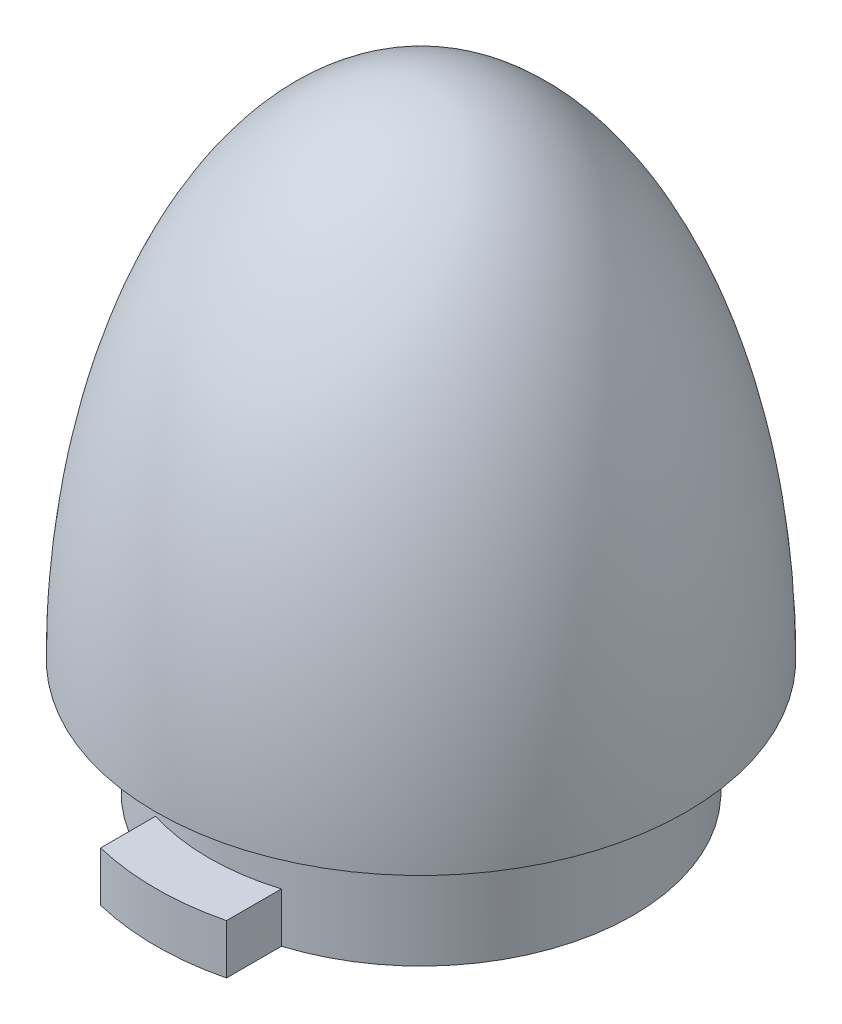
ISO-10303-21;
HEADER;
FILE_DESCRIPTION(('STEP AP214'),'2;1');
FILE_NAME('part.step','',(''),(''),'','','');
FILE_SCHEMA(('AUTOMOTIVE_DESIGN { 1 0 10303 214 1 1 1 1 }'));
ENDSEC;
DATA;
#1=APPLICATION_CONTEXT('core data for automotive mechanical design processes');
#2=APPLICATION_PROTOCOL_DEFINITION('international standard','automotive_design',2000,#1);
#3=PRODUCT_CONTEXT('',#1,'mechanical');
#4=PRODUCT('Part','Part','',(#3));
#5=PRODUCT_RELATED_PRODUCT_CATEGORY('part','',(#4));
#6=PRODUCT_DEFINITION_FORMATION('','',#4);
#7=PRODUCT_DEFINITION_CONTEXT('part definition',#1,'design');
#8=PRODUCT_DEFINITION('design','',#6,#7);
#9=PRODUCT_DEFINITION_SHAPE('','',#8);
#10=(LENGTH_UNIT() NAMED_UNIT(*) SI_UNIT(.MILLI.,.METRE.));
#11=(NAMED_UNIT(*) PLANE_ANGLE_UNIT() SI_UNIT($,.RADIAN.));
#12=(NAMED_UNIT(*) SI_UNIT($,.STERADIAN.) SOLID_ANGLE_UNIT());
#13=UNCERTAINTY_MEASURE_WITH_UNIT(LENGTH_MEASURE(1.E-05),#10,'distance_accuracy_value','');
#14=(GEOMETRIC_REPRESENTATION_CONTEXT(3) GLOBAL_UNCERTAINTY_ASSIGNED_CONTEXT((#13)) GLOBAL_UNIT_ASSIGNED_CONTEXT((#10,
#11,#12)) REPRESENTATION_CONTEXT('',''));
#15=CARTESIAN_POINT('',(0.,0.,0.));
#16=DIRECTION('',(0.,0.,1.));
#17=DIRECTION('',(1.,0.,0.));
#18=AXIS2_PLACEMENT_3D('',#15,#16,#17);
#19=CARTESIAN_POINT('',(0.,0.,8.128));
#20=DIRECTION('',(0.,1.,0.));
#21=DIRECTION('',(0.,0.,1.));
#22=AXIS2_PLACEMENT_3D('',#19,#20,#21);
#23=PLANE('',#22);
#24=CARTESIAN_POINT('',(0.,0.,0.));
#25=DIRECTION('',(0.,-1.,0.));
#26=DIRECTION('',(0.,0.,-1.));
#27=AXIS2_PLACEMENT_3D('',#24,#25,#26);
#28=CIRCLE('',#27,6.096);
#29=CARTESIAN_POINT('',(0.,0.,-6.096));
#30=VERTEX_POINT('',#29);
#31=EDGE_CURVE('E166',#30,#30,#28,.T.);
#32=ORIENTED_EDGE('',*,*,#31,.F.);
#33=EDGE_LOOP('',(#32));
#34=FACE_BOUND('',#33,.T.);
#35=CARTESIAN_POINT('',(0.,0.,0.));
#36=DIRECTION('',(0.,-1.,0.));
#37=DIRECTION('',(0.,0.,-1.));
#38=AXIS2_PLACEMENT_3D('',#35,#36,#37);
#39=CIRCLE('',#38,8.128);
#40=CARTESIAN_POINT('',(-2.413,0.,7.76156008802354));
#41=VERTEX_POINT('',#40);
#42=CARTESIAN_POINT('',(-2.413,0.,-7.76156008802354));
#43=VERTEX_POINT('',#42);
#44=EDGE_CURVE('E11',#41,#43,#39,.T.);
#45=ORIENTED_EDGE('',*,*,#44,.T.);
#46=DIRECTION('',(0.,0.,-1.));
#47=VECTOR('',#46,1.);
#48=CARTESIAN_POINT('',(-2.41299999999999,0.,8.128));
#49=LINE('',#48,#47);
#50=CARTESIAN_POINT('',(-2.413,0.,-9.86929739140533));
#51=VERTEX_POINT('',#50);
#52=EDGE_CURVE('E122',#43,#51,#49,.T.);
#53=ORIENTED_EDGE('',*,*,#52,.T.);
#54=CARTESIAN_POINT('',(0.,0.,0.));
#55=DIRECTION('',(0.,1.,0.));
#56=DIRECTION('',(0.,0.,1.));
#57=AXIS2_PLACEMENT_3D('',#54,#55,#56);
#58=CIRCLE('',#57,10.16);
#59=CARTESIAN_POINT('',(2.413,0.,-9.86929739140533));
#60=VERTEX_POINT('',#59);
#61=EDGE_CURVE('E113',#60,#51,#58,.T.);
#62=ORIENTED_EDGE('',*,*,#61,.F.);
#63=DIRECTION('',(0.,0.,1.));
#64=VECTOR('',#63,1.);
#65=CARTESIAN_POINT('',(2.41299999999999,0.,8.128));
#66=LINE('',#65,#64);
#67=CARTESIAN_POINT('',(2.413,0.,-7.76156008802354));
#68=VERTEX_POINT('',#67);
#69=EDGE_CURVE('E53',#60,#68,#66,.T.);
#70=ORIENTED_EDGE('',*,*,#69,.T.);
#71=CARTESIAN_POINT('',(2.413,0.,7.76156008802354));
#72=VERTEX_POINT('',#71);
#73=EDGE_CURVE('E46',#68,#72,#39,.T.);
#74=ORIENTED_EDGE('',*,*,#73,.T.);
#75=DIRECTION('',(0.,0.,1.));
#76=VECTOR('',#75,1.);
#77=CARTESIAN_POINT('',(2.413,0.,8.128));
#78=LINE('',#77,#76);
#79=CARTESIAN_POINT('',(2.413,0.,9.86929739140533));
#80=VERTEX_POINT('',#79);
#81=EDGE_CURVE('E154',#72,#80,#78,.T.);
#82=ORIENTED_EDGE('',*,*,#81,.T.);
#83=CARTESIAN_POINT('',(0.,0.,0.));
#84=DIRECTION('',(0.,1.,0.));
#85=DIRECTION('',(0.,0.,1.));
#86=AXIS2_PLACEMENT_3D('',#83,#84,#85);
#87=CIRCLE('',#86,10.16);
#88=CARTESIAN_POINT('',(-2.413,0.,9.86929739140533));
#89=VERTEX_POINT('',#88);
#90=EDGE_CURVE('E123',#89,#80,#87,.T.);
#91=ORIENTED_EDGE('',*,*,#90,.F.);
#92=DIRECTION('',(0.,0.,-1.));
#93=VECTOR('',#92,1.);
#94=CARTESIAN_POINT('',(-2.413,0.,8.128));
#95=LINE('',#94,#93);
#96=EDGE_CURVE('E59',#89,#41,#95,.T.);
#97=ORIENTED_EDGE('',*,*,#96,.T.);
#98=EDGE_LOOP('',(#45,#53,#62,#70,#74,#82,#91,#97));
#99=FACE_BOUND('',#98,.T.);
#100=ADVANCED_FACE('F39',(#34,#99),#23,.F.);
#101=CARTESIAN_POINT('',(0.,0.,0.));
#102=DIRECTION('',(0.,-1.,0.));
#103=DIRECTION('',(0.,0.,-1.));
#104=AXIS2_PLACEMENT_3D('',#101,#102,#103);
#105=CYLINDRICAL_SURFACE('',#104,8.128);
#106=CARTESIAN_POINT('',(0.,1.905,0.));
#107=DIRECTION('',(0.,1.,0.));
#108=DIRECTION('',(0.,0.,1.));
#109=AXIS2_PLACEMENT_3D('',#106,#107,#108);
#110=CIRCLE('',#109,8.128);
#111=CARTESIAN_POINT('',(2.413,1.905,-7.76156008802354));
#112=VERTEX_POINT('',#111);
#113=CARTESIAN_POINT('',(-2.413,1.905,-7.76156008802354));
#114=VERTEX_POINT('',#113);
#115=EDGE_CURVE('E135',#112,#114,#110,.T.);
#116=ORIENTED_EDGE('',*,*,#115,.T.);
#117=DIRECTION('',(0.,-1.,0.));
#118=VECTOR('',#117,1.);
#119=CARTESIAN_POINT('',(-2.413,1.905,-7.76156008802354));
#120=LINE('',#119,#118);
#121=EDGE_CURVE('E373',#114,#43,#120,.T.);
#122=ORIENTED_EDGE('',*,*,#121,.T.);
#123=ORIENTED_EDGE('',*,*,#44,.F.);
#124=DIRECTION('',(0.,-1.,0.));
#125=VECTOR('',#124,1.);
#126=CARTESIAN_POINT('',(-2.413,1.905,7.76156008802354));
#127=LINE('',#126,#125);
#128=CARTESIAN_POINT('',(-2.413,1.905,7.76156008802354));
#129=VERTEX_POINT('',#128);
#130=EDGE_CURVE('E159',#129,#41,#127,.T.);
#131=ORIENTED_EDGE('',*,*,#130,.F.);
#132=CARTESIAN_POINT('',(0.,1.905,0.));
#133=DIRECTION('',(0.,1.,0.));
#134=DIRECTION('',(0.,0.,1.));
#135=AXIS2_PLACEMENT_3D('',#132,#133,#134);
#136=CIRCLE('',#135,8.128);
#137=CARTESIAN_POINT('',(2.413,1.905,7.76156008802354));
#138=VERTEX_POINT('',#137);
#139=EDGE_CURVE('E145',#129,#138,#136,.T.);
#140=ORIENTED_EDGE('',*,*,#139,.T.);
#141=DIRECTION('',(0.,-1.,0.));
#142=VECTOR('',#141,1.);
#143=CARTESIAN_POINT('',(2.413,1.905,7.76156008802354));
#144=LINE('',#143,#142);
#145=EDGE_CURVE('E161',#138,#72,#144,.T.);
#146=ORIENTED_EDGE('',*,*,#145,.T.);
#147=ORIENTED_EDGE('',*,*,#73,.F.);
#148=DIRECTION('',(0.,-1.,0.));
#149=VECTOR('',#148,1.);
#150=CARTESIAN_POINT('',(2.413,1.905,-7.76156008802354));
#151=LINE('',#150,#149);
#152=EDGE_CURVE('E120',#112,#68,#151,.T.);
#153=ORIENTED_EDGE('',*,*,#152,.F.);
#154=EDGE_LOOP('',(#116,#122,#123,#131,#140,#146,#147,#153));
#155=FACE_BOUND('',#154,.T.);
#156=CARTESIAN_POINT('',(0.,4.445,0.));
#157=DIRECTION('',(0.,-1.,0.));
#158=DIRECTION('',(0.,0.,-1.));
#159=AXIS2_PLACEMENT_3D('',#156,#157,#158);
#160=CIRCLE('',#159,8.128);
#161=CARTESIAN_POINT('',(0.,4.445,-8.128));
#162=VERTEX_POINT('',#161);
#163=EDGE_CURVE('E202',#162,#162,#160,.T.);
#164=ORIENTED_EDGE('',*,*,#163,.T.);
#165=EDGE_LOOP('',(#164));
#166=FACE_BOUND('',#165,.T.);
#167=ADVANCED_FACE('F190',(#155,#166),#105,.T.);
#168=CARTESIAN_POINT('',(0.,4.445,8.128));
#169=DIRECTION('',(0.,1.,0.));
#170=DIRECTION('',(0.,0.,1.));
#171=AXIS2_PLACEMENT_3D('',#168,#169,#170);
#172=PLANE('',#171);
#173=ORIENTED_EDGE('',*,*,#163,.F.);
#174=EDGE_LOOP('',(#173));
#175=FACE_BOUND('',#174,.T.);
#176=CARTESIAN_POINT('',(0.,4.445,0.));
#177=DIRECTION('',(0.,-1.,0.));
#178=DIRECTION('',(0.,0.,-1.));
#179=AXIS2_PLACEMENT_3D('',#176,#177,#178);
#180=CIRCLE('',#179,10.16);
#181=CARTESIAN_POINT('',(0.,4.445,-10.16));
#182=VERTEX_POINT('',#181);
#183=EDGE_CURVE('E203',#182,#182,#180,.T.);
#184=ORIENTED_EDGE('',*,*,#183,.T.);
#185=EDGE_LOOP('',(#184));
#186=FACE_BOUND('',#185,.T.);
#187=ADVANCED_FACE('F187',(#175,#186),#172,.F.);
#188=CARTESIAN_POINT('',(0.,4.445,1.31385821547456E-13));
#189=DIRECTION('',(1.,0.,0.));
#190=DIRECTION('',(0.,-1.,0.));
#191=AXIS2_PLACEMENT_3D('',#188,#189,#190);
#192=ELLIPSE('',#191,19.05,10.1599999999999);
#193=TRIMMED_CURVE('',#192,(PARAMETER_VALUE(3.14159265358978)),
(PARAMETER_VALUE(6.2831853071796)),.T.,.PARAMETER.);
#194=CARTESIAN_POINT('',(0.,0.,0.));
#195=DIRECTION('',(0.,-1.,0.));
#196=AXIS1_PLACEMENT('',#194,#195);
#197=SURFACE_OF_REVOLUTION('',#193,#196);
#198=ORIENTED_EDGE('',*,*,#183,.F.);
#199=EDGE_LOOP('',(#198));
#200=FACE_BOUND('',#199,.T.);
#201=CARTESIAN_POINT('',(0.,23.495,0.));
#202=VERTEX_POINT('',#201);
#203=VERTEX_LOOP('',#202);
#204=FACE_BOUND('',#203,.T.);
#205=ADVANCED_FACE('F182',(#200,#204),#197,.T.);
#206=CARTESIAN_POINT('',(0.,6.47700000000001,8.06650855524508));
#207=CARTESIAN_POINT('',(0.,7.54516851846274,8.00164177222113));
#208=CARTESIAN_POINT('',(0.,9.70775905244594,7.76329370612508));
#209=CARTESIAN_POINT('',(0.,12.7129061846973,7.10849540277122));
#210=CARTESIAN_POINT('',(0.,15.4166874288281,6.18547281986769));
#211=CARTESIAN_POINT('',(0.,17.6991720978405,5.04556665310744));
#212=CARTESIAN_POINT('',(0.,19.4747331163462,3.75998048202053));
#213=CARTESIAN_POINT('',(0.,20.6847050617529,2.42944522517798));
#214=CARTESIAN_POINT('',(0.,21.335826730527,1.1533899415434));
#215=CARTESIAN_POINT('',(0.,21.463,0.398270958817136));
#216=CARTESIAN_POINT('',(0.,21.463,0.));
#217=B_SPLINE_CURVE_WITH_KNOTS('',3,(#206,#207,#208,#209,#210,#211,#212,#213,#214,#215,#216),
.UNSPECIFIED.,.F.,.F.,(4,1,1,1,1,1,1,1,4),(3.14159265358978,3.3237703140792,3.50594797456862,
3.68812563505804,3.87030329554746,4.05248095603688,4.2346586165263,4.41683627701572,
4.59901393750514),.UNSPECIFIED.);
#218=CARTESIAN_POINT('',(0.,0.,0.));
#219=DIRECTION('',(0.,-1.,0.));
#220=AXIS1_PLACEMENT('',#218,#219);
#221=SURFACE_OF_REVOLUTION('',#217,#220);
#222=CARTESIAN_POINT('',(0.,21.463,0.));
#223=VERTEX_POINT('',#222);
#224=VERTEX_LOOP('',#223);
#225=FACE_BOUND('',#224,.T.);
#226=CARTESIAN_POINT('',(0.,6.47700000000001,0.));
#227=DIRECTION('',(0.,-1.,0.));
#228=DIRECTION('',(0.,0.,-1.));
#229=AXIS2_PLACEMENT_3D('',#226,#227,#228);
#230=CIRCLE('',#229,8.06650855524508);
#231=CARTESIAN_POINT('',(0.,6.47700000000001,-8.06650855524508));
#232=VERTEX_POINT('',#231);
#233=EDGE_CURVE('E205',#232,#232,#230,.T.);
#234=ORIENTED_EDGE('',*,*,#233,.T.);
#235=EDGE_LOOP('',(#234));
#236=FACE_BOUND('',#235,.T.);
#237=ADVANCED_FACE('F177',(#225,#236),#221,.T.);
#238=CARTESIAN_POINT('',(0.,6.47700000000001,6.096));
#239=DIRECTION('',(0.,-1.,0.));
#240=DIRECTION('',(0.,0.,-1.));
#241=AXIS2_PLACEMENT_3D('',#238,#239,#240);
#242=PLANE('',#241);
#243=ORIENTED_EDGE('',*,*,#233,.F.);
#244=EDGE_LOOP('',(#243));
#245=FACE_BOUND('',#244,.T.);
#246=CARTESIAN_POINT('',(0.,6.477,0.));
#247=DIRECTION('',(0.,-1.,0.));
#248=DIRECTION('',(0.,0.,-1.));
#249=AXIS2_PLACEMENT_3D('',#246,#247,#248);
#250=CIRCLE('',#249,6.096);
#251=CARTESIAN_POINT('',(0.,6.477,-6.096));
#252=VERTEX_POINT('',#251);
#253=EDGE_CURVE('E210',#252,#252,#250,.T.);
#254=ORIENTED_EDGE('',*,*,#253,.T.);
#255=EDGE_LOOP('',(#254));
#256=FACE_BOUND('',#255,.T.);
#257=ADVANCED_FACE('F181',(#245,#256),#242,.F.);
#258=CARTESIAN_POINT('',(0.,0.,0.));
#259=DIRECTION('',(0.,-1.,0.));
#260=DIRECTION('',(0.,0.,-1.));
#261=AXIS2_PLACEMENT_3D('',#258,#259,#260);
#262=CYLINDRICAL_SURFACE('',#261,6.096);
#263=ORIENTED_EDGE('',*,*,#253,.F.);
#264=EDGE_LOOP('',(#263));
#265=FACE_BOUND('',#264,.T.);
#266=ORIENTED_EDGE('',*,*,#31,.T.);
#267=EDGE_LOOP('',(#266));
#268=FACE_BOUND('',#267,.T.);
#269=ADVANCED_FACE('F215',(#265,#268),#262,.F.);
#270=CARTESIAN_POINT('',(0.,1.905,0.));
#271=DIRECTION('',(0.,-1.,0.));
#272=DIRECTION('',(0.,0.,-1.));
#273=AXIS2_PLACEMENT_3D('',#270,#271,#272);
#274=CYLINDRICAL_SURFACE('',#273,10.16);
#275=ORIENTED_EDGE('',*,*,#90,.T.);
#276=DIRECTION('',(0.,-1.,0.));
#277=VECTOR('',#276,1.);
#278=CARTESIAN_POINT('',(2.413,1.905,9.86929739140533));
#279=LINE('',#278,#277);
#280=CARTESIAN_POINT('',(2.413,1.905,9.86929739140533));
#281=VERTEX_POINT('',#280);
#282=EDGE_CURVE('E164',#281,#80,#279,.T.);
#283=ORIENTED_EDGE('',*,*,#282,.F.);
#284=CARTESIAN_POINT('',(0.,1.905,0.));
#285=DIRECTION('',(0.,1.,0.));
#286=DIRECTION('',(0.,0.,1.));
#287=AXIS2_PLACEMENT_3D('',#284,#285,#286);
#288=CIRCLE('',#287,10.16);
#289=CARTESIAN_POINT('',(-2.413,1.905,9.86929739140533));
#290=VERTEX_POINT('',#289);
#291=EDGE_CURVE('E140',#290,#281,#288,.T.);
#292=ORIENTED_EDGE('',*,*,#291,.F.);
#293=DIRECTION('',(0.,-1.,0.));
#294=VECTOR('',#293,1.);
#295=CARTESIAN_POINT('',(-2.413,1.905,9.86929739140533));
#296=LINE('',#295,#294);
#297=EDGE_CURVE('E151',#290,#89,#296,.T.);
#298=ORIENTED_EDGE('',*,*,#297,.T.);
#299=EDGE_LOOP('',(#275,#283,#292,#298));
#300=FACE_BOUND('',#299,.T.);
#301=ADVANCED_FACE('F217',(#300),#274,.T.);
#302=CARTESIAN_POINT('',(2.413,1.905,8.128));
#303=DIRECTION('',(1.,0.,0.));
#304=DIRECTION('',(0.,0.,-1.));
#305=AXIS2_PLACEMENT_3D('',#302,#303,#304);
#306=PLANE('',#305);
#307=ORIENTED_EDGE('',*,*,#81,.F.);
#308=ORIENTED_EDGE('',*,*,#145,.F.);
#309=DIRECTION('',(0.,0.,1.));
#310=VECTOR('',#309,1.);
#311=CARTESIAN_POINT('',(2.413,1.905,8.128));
#312=LINE('',#311,#310);
#313=EDGE_CURVE('E142',#138,#281,#312,.T.);
#314=ORIENTED_EDGE('',*,*,#313,.T.);
#315=ORIENTED_EDGE('',*,*,#282,.T.);
#316=EDGE_LOOP('',(#307,#308,#314,#315));
#317=FACE_BOUND('',#316,.T.);
#318=ADVANCED_FACE('F223',(#317),#306,.T.);
#319=CARTESIAN_POINT('',(-2.413,1.905,8.128));
#320=DIRECTION('',(-1.,0.,0.));
#321=DIRECTION('',(0.,0.,1.));
#322=AXIS2_PLACEMENT_3D('',#319,#320,#321);
#323=PLANE('',#322);
#324=ORIENTED_EDGE('',*,*,#96,.F.);
#325=ORIENTED_EDGE('',*,*,#297,.F.);
#326=DIRECTION('',(0.,0.,-1.));
#327=VECTOR('',#326,1.);
#328=CARTESIAN_POINT('',(-2.413,1.905,8.128));
#329=LINE('',#328,#327);
#330=EDGE_CURVE('E148',#290,#129,#329,.T.);
#331=ORIENTED_EDGE('',*,*,#330,.T.);
#332=ORIENTED_EDGE('',*,*,#130,.T.);
#333=EDGE_LOOP('',(#324,#325,#331,#332));
#334=FACE_BOUND('',#333,.T.);
#335=ADVANCED_FACE('F231',(#334),#323,.T.);
#336=CARTESIAN_POINT('',(0.,1.905,0.));
#337=DIRECTION('',(0.,1.,0.));
#338=DIRECTION('',(0.,0.,1.));
#339=AXIS2_PLACEMENT_3D('',#336,#337,#338);
#340=PLANE('',#339);
#341=ORIENTED_EDGE('',*,*,#291,.T.);
#342=ORIENTED_EDGE('',*,*,#313,.F.);
#343=ORIENTED_EDGE('',*,*,#139,.F.);
#344=ORIENTED_EDGE('',*,*,#330,.F.);
#345=EDGE_LOOP('',(#341,#342,#343,#344));
#346=FACE_BOUND('',#345,.T.);
#347=ADVANCED_FACE('F235',(#346),#340,.T.);
#348=CARTESIAN_POINT('',(0.,1.905,0.));
#349=DIRECTION('',(0.,-1.,0.));
#350=DIRECTION('',(0.,0.,-1.));
#351=AXIS2_PLACEMENT_3D('',#348,#349,#350);
#352=CYLINDRICAL_SURFACE('',#351,10.16);
#353=ORIENTED_EDGE('',*,*,#61,.T.);
#354=DIRECTION('',(0.,-1.,0.));
#355=VECTOR('',#354,1.);
#356=CARTESIAN_POINT('',(-2.413,1.905,-9.86929739140533));
#357=LINE('',#356,#355);
#358=CARTESIAN_POINT('',(-2.413,1.905,-9.86929739140533));
#359=VERTEX_POINT('',#358);
#360=EDGE_CURVE('E375',#359,#51,#357,.T.);
#361=ORIENTED_EDGE('',*,*,#360,.F.);
#362=CARTESIAN_POINT('',(0.,1.905,0.));
#363=DIRECTION('',(0.,1.,0.));
#364=DIRECTION('',(0.,0.,1.));
#365=AXIS2_PLACEMENT_3D('',#362,#363,#364);
#366=CIRCLE('',#365,10.16);
#367=CARTESIAN_POINT('',(2.413,1.905,-9.86929739140533));
#368=VERTEX_POINT('',#367);
#369=EDGE_CURVE('E115',#368,#359,#366,.T.);
#370=ORIENTED_EDGE('',*,*,#369,.F.);
#371=DIRECTION('',(0.,-1.,0.));
#372=VECTOR('',#371,1.);
#373=CARTESIAN_POINT('',(2.413,1.905,-9.86929739140533));
#374=LINE('',#373,#372);
#375=EDGE_CURVE('E110',#368,#60,#374,.T.);
#376=ORIENTED_EDGE('',*,*,#375,.T.);
#377=EDGE_LOOP('',(#353,#361,#370,#376));
#378=FACE_BOUND('',#377,.T.);
#379=ADVANCED_FACE('F111',(#378),#352,.T.);
#380=CARTESIAN_POINT('',(-2.41299999999999,1.905,8.128));
#381=DIRECTION('',(-1.,0.,0.));
#382=DIRECTION('',(0.,0.,1.));
#383=AXIS2_PLACEMENT_3D('',#380,#381,#382);
#384=PLANE('',#383);
#385=ORIENTED_EDGE('',*,*,#52,.F.);
#386=ORIENTED_EDGE('',*,*,#121,.F.);
#387=DIRECTION('',(0.,0.,-1.));
#388=VECTOR('',#387,1.);
#389=CARTESIAN_POINT('',(-2.41299999999999,1.905,8.128));
#390=LINE('',#389,#388);
#391=EDGE_CURVE('E130',#114,#359,#390,.T.);
#392=ORIENTED_EDGE('',*,*,#391,.T.);
#393=ORIENTED_EDGE('',*,*,#360,.T.);
#394=EDGE_LOOP('',(#385,#386,#392,#393));
#395=FACE_BOUND('',#394,.T.);
#396=ADVANCED_FACE('F246',(#395),#384,.T.);
#397=CARTESIAN_POINT('',(2.41299999999999,1.905,8.128));
#398=DIRECTION('',(1.,0.,0.));
#399=DIRECTION('',(0.,0.,-1.));
#400=AXIS2_PLACEMENT_3D('',#397,#398,#399);
#401=PLANE('',#400);
#402=ORIENTED_EDGE('',*,*,#69,.F.);
#403=ORIENTED_EDGE('',*,*,#375,.F.);
#404=DIRECTION('',(0.,0.,1.));
#405=VECTOR('',#404,1.);
#406=CARTESIAN_POINT('',(2.41299999999999,1.905,8.128));
#407=LINE('',#406,#405);
#408=EDGE_CURVE('E119',#368,#112,#407,.T.);
#409=ORIENTED_EDGE('',*,*,#408,.T.);
#410=ORIENTED_EDGE('',*,*,#152,.T.);
#411=EDGE_LOOP('',(#402,#403,#409,#410));
#412=FACE_BOUND('',#411,.T.);
#413=ADVANCED_FACE('F125',(#412),#401,.T.);
#414=CARTESIAN_POINT('',(0.,1.905,0.));
#415=DIRECTION('',(0.,1.,0.));
#416=DIRECTION('',(0.,0.,1.));
#417=AXIS2_PLACEMENT_3D('',#414,#415,#416);
#418=PLANE('',#417);
#419=ORIENTED_EDGE('',*,*,#369,.T.);
#420=ORIENTED_EDGE('',*,*,#391,.F.);
#421=ORIENTED_EDGE('',*,*,#115,.F.);
#422=ORIENTED_EDGE('',*,*,#408,.F.);
#423=EDGE_LOOP('',(#419,#420,#421,#422));
#424=FACE_BOUND('',#423,.T.);
#425=ADVANCED_FACE('F240',(#424),#418,.T.);
#426=CLOSED_SHELL('',(#100,#167,#187,#205,#237,#257,#269,#301,#318,#335,#347,#379,#396,#413,#425));
#427=MANIFOLD_SOLID_BREP('B2',#426);
#428=ADVANCED_BREP_SHAPE_REPRESENTATION('',(#18,#427),#14);
#429=SHAPE_DEFINITION_REPRESENTATION(#9,#428);
ENDSEC;
END-ISO-10303-21;
